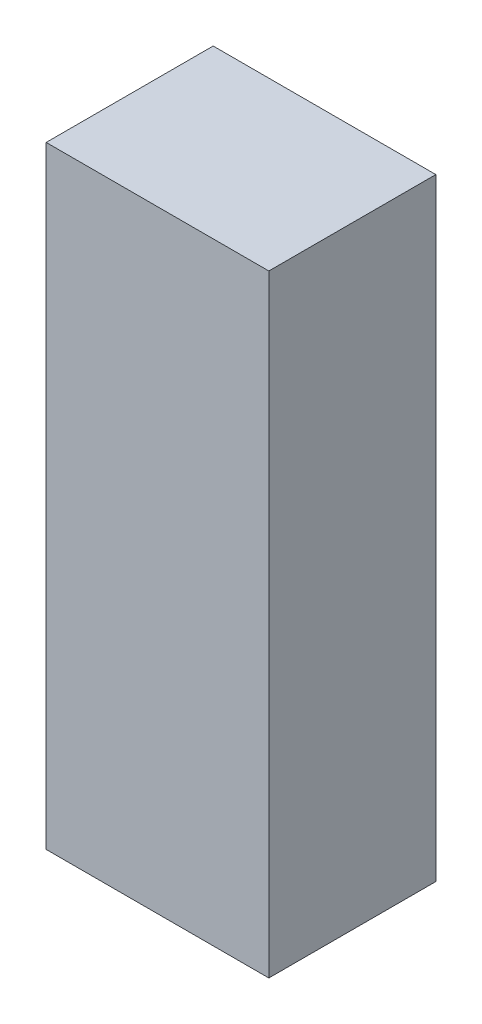
ISO-10303-21;
HEADER;
FILE_DESCRIPTION(('STEP AP214'),'2;1');
FILE_NAME('part.step','',(''),(''),'','','');
FILE_SCHEMA(('AUTOMOTIVE_DESIGN { 1 0 10303 214 1 1 1 1 }'));
ENDSEC;
DATA;
#1=APPLICATION_CONTEXT('core data for automotive mechanical design processes');
#2=APPLICATION_PROTOCOL_DEFINITION('international standard','automotive_design',2000,#1);
#3=PRODUCT_CONTEXT('',#1,'mechanical');
#4=PRODUCT('Part','Part','',(#3));
#5=PRODUCT_RELATED_PRODUCT_CATEGORY('part','',(#4));
#6=PRODUCT_DEFINITION_FORMATION('','',#4);
#7=PRODUCT_DEFINITION_CONTEXT('part definition',#1,'design');
#8=PRODUCT_DEFINITION('design','',#6,#7);
#9=PRODUCT_DEFINITION_SHAPE('','',#8);
#10=(LENGTH_UNIT() NAMED_UNIT(*) SI_UNIT(.MILLI.,.METRE.));
#11=(NAMED_UNIT(*) PLANE_ANGLE_UNIT() SI_UNIT($,.RADIAN.));
#12=(NAMED_UNIT(*) SI_UNIT($,.STERADIAN.) SOLID_ANGLE_UNIT());
#13=UNCERTAINTY_MEASURE_WITH_UNIT(LENGTH_MEASURE(1.E-05),#10,'distance_accuracy_value','');
#14=(GEOMETRIC_REPRESENTATION_CONTEXT(3) GLOBAL_UNCERTAINTY_ASSIGNED_CONTEXT((#13)) GLOBAL_UNIT_ASSIGNED_CONTEXT((#10,
#11,#12)) REPRESENTATION_CONTEXT('',''));
#15=CARTESIAN_POINT('',(0.,0.,0.));
#16=DIRECTION('',(0.,0.,1.));
#17=DIRECTION('',(1.,0.,0.));
#18=AXIS2_PLACEMENT_3D('',#15,#16,#17);
#19=CARTESIAN_POINT('',(0.,-2800.,-1.47021566313835E-13));
#20=DIRECTION('',(-1.,0.,0.));
#21=DIRECTION('',(0.,0.,1.));
#22=AXIS2_PLACEMENT_3D('',#19,#20,#21);
#23=PLANE('',#22);
#24=DIRECTION('',(0.,0.,-1.));
#25=VECTOR('',#24,1.);
#26=CARTESIAN_POINT('',(0.,-3900.,0.));
#27=LINE('',#26,#25);
#28=CARTESIAN_POINT('',(0.,-3900.,300.));
#29=VERTEX_POINT('',#28);
#30=CARTESIAN_POINT('',(0.,-3900.,0.));
#31=VERTEX_POINT('',#30);
#32=EDGE_CURVE('E100',#29,#31,#27,.T.);
#33=ORIENTED_EDGE('',*,*,#32,.T.);
#34=DIRECTION('',(0.,-1.,0.));
#35=VECTOR('',#34,1.);
#36=CARTESIAN_POINT('',(0.,-2800.,-1.47021566313835E-13));
#37=LINE('',#36,#35);
#38=CARTESIAN_POINT('',(0.,-2800.,-1.47021566313835E-13));
#39=VERTEX_POINT('',#38);
#40=EDGE_CURVE('E11',#39,#31,#37,.T.);
#41=ORIENTED_EDGE('',*,*,#40,.F.);
#42=DIRECTION('',(0.,0.,-1.));
#43=VECTOR('',#42,1.);
#44=CARTESIAN_POINT('',(0.,-2800.,-1.47021566313835E-13));
#45=LINE('',#44,#43);
#46=CARTESIAN_POINT('',(0.,-2800.,300.));
#47=VERTEX_POINT('',#46);
#48=EDGE_CURVE('E88',#47,#39,#45,.T.);
#49=ORIENTED_EDGE('',*,*,#48,.F.);
#50=DIRECTION('',(0.,-1.,0.));
#51=VECTOR('',#50,1.);
#52=CARTESIAN_POINT('',(0.,-2800.,300.));
#53=LINE('',#52,#51);
#54=EDGE_CURVE('E96',#47,#29,#53,.T.);
#55=ORIENTED_EDGE('',*,*,#54,.T.);
#56=EDGE_LOOP('',(#33,#41,#49,#55));
#57=FACE_BOUND('',#56,.T.);
#58=ADVANCED_FACE('F37',(#57),#23,.F.);
#59=CARTESIAN_POINT('',(0.,-2800.,-1.47021566313835E-13));
#60=DIRECTION('',(0.,0.,1.));
#61=DIRECTION('',(0.,-1.,0.));
#62=AXIS2_PLACEMENT_3D('',#59,#60,#61);
#63=PLANE('',#62);
#64=DIRECTION('',(-1.,0.,0.));
#65=VECTOR('',#64,1.);
#66=CARTESIAN_POINT('',(0.,-3900.,0.));
#67=LINE('',#66,#65);
#68=CARTESIAN_POINT('',(-400.,-3900.,0.));
#69=VERTEX_POINT('',#68);
#70=EDGE_CURVE('E92',#31,#69,#67,.T.);
#71=ORIENTED_EDGE('',*,*,#70,.T.);
#72=DIRECTION('',(0.,-1.,0.));
#73=VECTOR('',#72,1.);
#74=CARTESIAN_POINT('',(-400.,-2800.,0.));
#75=LINE('',#74,#73);
#76=CARTESIAN_POINT('',(-400.,-2800.,0.));
#77=VERTEX_POINT('',#76);
#78=EDGE_CURVE('E45',#77,#69,#75,.T.);
#79=ORIENTED_EDGE('',*,*,#78,.F.);
#80=DIRECTION('',(-1.,0.,0.));
#81=VECTOR('',#80,1.);
#82=CARTESIAN_POINT('',(0.,-2800.,-1.47021566313835E-13));
#83=LINE('',#82,#81);
#84=EDGE_CURVE('E83',#39,#77,#83,.T.);
#85=ORIENTED_EDGE('',*,*,#84,.F.);
#86=ORIENTED_EDGE('',*,*,#40,.T.);
#87=EDGE_LOOP('',(#71,#79,#85,#86));
#88=FACE_BOUND('',#87,.T.);
#89=ADVANCED_FACE('F91',(#88),#63,.F.);
#90=CARTESIAN_POINT('',(-400.,-2800.,0.));
#91=DIRECTION('',(1.,0.,0.));
#92=DIRECTION('',(0.,0.,-1.));
#93=AXIS2_PLACEMENT_3D('',#90,#91,#92);
#94=PLANE('',#93);
#95=DIRECTION('',(0.,0.,1.));
#96=VECTOR('',#95,1.);
#97=CARTESIAN_POINT('',(-400.,-3900.,0.));
#98=LINE('',#97,#96);
#99=CARTESIAN_POINT('',(-400.,-3900.,300.));
#100=VERTEX_POINT('',#99);
#101=EDGE_CURVE('E70',#69,#100,#98,.T.);
#102=ORIENTED_EDGE('',*,*,#101,.T.);
#103=DIRECTION('',(0.,-1.,0.));
#104=VECTOR('',#103,1.);
#105=CARTESIAN_POINT('',(-400.,-2800.,300.));
#106=LINE('',#105,#104);
#107=CARTESIAN_POINT('',(-400.,-2800.,300.));
#108=VERTEX_POINT('',#107);
#109=EDGE_CURVE('E93',#108,#100,#106,.T.);
#110=ORIENTED_EDGE('',*,*,#109,.F.);
#111=DIRECTION('',(0.,0.,1.));
#112=VECTOR('',#111,1.);
#113=CARTESIAN_POINT('',(-400.,-2800.,0.));
#114=LINE('',#113,#112);
#115=EDGE_CURVE('E86',#77,#108,#114,.T.);
#116=ORIENTED_EDGE('',*,*,#115,.F.);
#117=ORIENTED_EDGE('',*,*,#78,.T.);
#118=EDGE_LOOP('',(#102,#110,#116,#117));
#119=FACE_BOUND('',#118,.T.);
#120=ADVANCED_FACE('F94',(#119),#94,.F.);
#121=CARTESIAN_POINT('',(0.,-2800.,300.));
#122=DIRECTION('',(0.,0.,-1.));
#123=DIRECTION('',(-1.,0.,0.));
#124=AXIS2_PLACEMENT_3D('',#121,#122,#123);
#125=PLANE('',#124);
#126=DIRECTION('',(1.,0.,0.));
#127=VECTOR('',#126,1.);
#128=CARTESIAN_POINT('',(0.,-3900.,300.));
#129=LINE('',#128,#127);
#130=EDGE_CURVE('E76',#100,#29,#129,.T.);
#131=ORIENTED_EDGE('',*,*,#130,.T.);
#132=ORIENTED_EDGE('',*,*,#54,.F.);
#133=DIRECTION('',(1.,0.,0.));
#134=VECTOR('',#133,1.);
#135=CARTESIAN_POINT('',(0.,-2800.,300.));
#136=LINE('',#135,#134);
#137=EDGE_CURVE('E53',#108,#47,#136,.T.);
#138=ORIENTED_EDGE('',*,*,#137,.F.);
#139=ORIENTED_EDGE('',*,*,#109,.T.);
#140=EDGE_LOOP('',(#131,#132,#138,#139));
#141=FACE_BOUND('',#140,.T.);
#142=ADVANCED_FACE('F107',(#141),#125,.F.);
#143=CARTESIAN_POINT('',(0.,-2800.,-1.47021566313835E-13));
#144=DIRECTION('',(0.,-1.,0.));
#145=DIRECTION('',(0.,0.,-1.));
#146=AXIS2_PLACEMENT_3D('',#143,#144,#145);
#147=PLANE('',#146);
#148=ORIENTED_EDGE('',*,*,#48,.T.);
#149=ORIENTED_EDGE('',*,*,#84,.T.);
#150=ORIENTED_EDGE('',*,*,#115,.T.);
#151=ORIENTED_EDGE('',*,*,#137,.T.);
#152=EDGE_LOOP('',(#148,#149,#150,#151));
#153=FACE_BOUND('',#152,.T.);
#154=ADVANCED_FACE('F84',(#153),#147,.F.);
#155=CARTESIAN_POINT('',(0.,-3900.,0.));
#156=DIRECTION('',(0.,-1.,0.));
#157=DIRECTION('',(0.,0.,-1.));
#158=AXIS2_PLACEMENT_3D('',#155,#156,#157);
#159=PLANE('',#158);
#160=ORIENTED_EDGE('',*,*,#32,.F.);
#161=ORIENTED_EDGE('',*,*,#130,.F.);
#162=ORIENTED_EDGE('',*,*,#101,.F.);
#163=ORIENTED_EDGE('',*,*,#70,.F.);
#164=EDGE_LOOP('',(#160,#161,#162,#163));
#165=FACE_BOUND('',#164,.T.);
#166=ADVANCED_FACE('F110',(#165),#159,.T.);
#167=CLOSED_SHELL('',(#58,#89,#120,#142,#154,#166));
#168=MANIFOLD_SOLID_BREP('B2',#167);
#169=ADVANCED_BREP_SHAPE_REPRESENTATION('',(#18,#168),#14);
#170=SHAPE_DEFINITION_REPRESENTATION(#9,#169);
ENDSEC;
END-ISO-10303-21;
